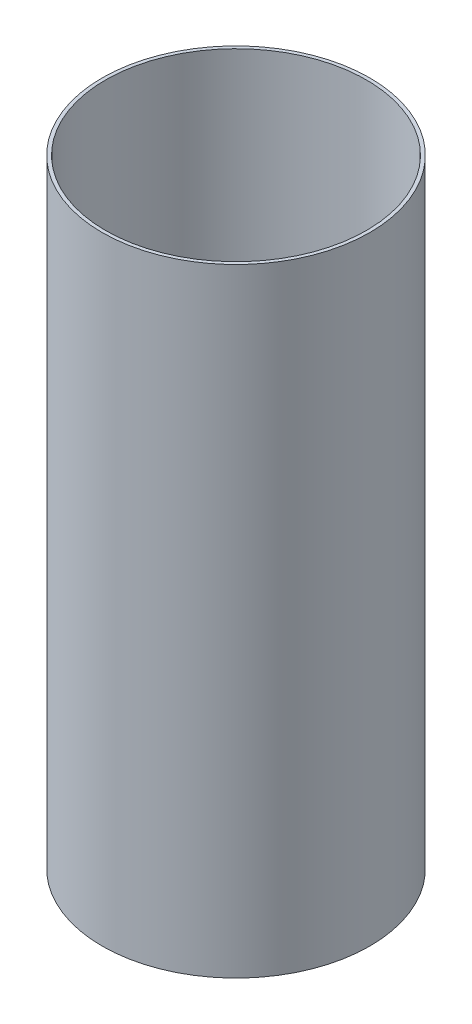
ISO-10303-21;
HEADER;
FILE_DESCRIPTION(('STEP AP214'),'2;1');
FILE_NAME('part.step','',(''),(''),'','','');
FILE_SCHEMA(('AUTOMOTIVE_DESIGN { 1 0 10303 214 1 1 1 1 }'));
ENDSEC;
DATA;
#1=APPLICATION_CONTEXT('core data for automotive mechanical design processes');
#2=APPLICATION_PROTOCOL_DEFINITION('international standard','automotive_design',2000,#1);
#3=PRODUCT_CONTEXT('',#1,'mechanical');
#4=PRODUCT('Part','Part','',(#3));
#5=PRODUCT_RELATED_PRODUCT_CATEGORY('part','',(#4));
#6=PRODUCT_DEFINITION_FORMATION('','',#4);
#7=PRODUCT_DEFINITION_CONTEXT('part definition',#1,'design');
#8=PRODUCT_DEFINITION('design','',#6,#7);
#9=PRODUCT_DEFINITION_SHAPE('','',#8);
#10=(LENGTH_UNIT() NAMED_UNIT(*) SI_UNIT(.MILLI.,.METRE.));
#11=(NAMED_UNIT(*) PLANE_ANGLE_UNIT() SI_UNIT($,.RADIAN.));
#12=(NAMED_UNIT(*) SI_UNIT($,.STERADIAN.) SOLID_ANGLE_UNIT());
#13=UNCERTAINTY_MEASURE_WITH_UNIT(LENGTH_MEASURE(1.E-05),#10,'distance_accuracy_value','');
#14=(GEOMETRIC_REPRESENTATION_CONTEXT(3) GLOBAL_UNCERTAINTY_ASSIGNED_CONTEXT((#13)) GLOBAL_UNIT_ASSIGNED_CONTEXT((#10,
#11,#12)) REPRESENTATION_CONTEXT('',''));
#15=CARTESIAN_POINT('',(0.,0.,0.));
#16=DIRECTION('',(0.,0.,1.));
#17=DIRECTION('',(1.,0.,0.));
#18=AXIS2_PLACEMENT_3D('',#15,#16,#17);
#19=CARTESIAN_POINT('',(0.,228.6,0.));
#20=DIRECTION('',(0.,1.,0.));
#21=DIRECTION('',(0.,0.,1.));
#22=AXIS2_PLACEMENT_3D('',#19,#20,#21);
#23=PLANE('',#22);
#24=CARTESIAN_POINT('',(0.,228.6,0.));
#25=DIRECTION('',(0.,1.,0.));
#26=DIRECTION('',(0.,0.,1.));
#27=AXIS2_PLACEMENT_3D('',#24,#25,#26);
#28=CIRCLE('',#27,49.53);
#29=CARTESIAN_POINT('',(0.,228.6,49.53));
#30=VERTEX_POINT('',#29);
#31=EDGE_CURVE('E10',#30,#30,#28,.T.);
#32=ORIENTED_EDGE('',*,*,#31,.T.);
#33=EDGE_LOOP('',(#32));
#34=FACE_BOUND('',#33,.T.);
#35=CARTESIAN_POINT('',(0.,228.6,0.));
#36=DIRECTION('',(0.,1.,0.));
#37=DIRECTION('',(0.,0.,1.));
#38=AXIS2_PLACEMENT_3D('',#35,#36,#37);
#39=CIRCLE('',#38,48.26);
#40=CARTESIAN_POINT('',(0.,228.6,48.26));
#41=VERTEX_POINT('',#40);
#42=EDGE_CURVE('E42',#41,#41,#39,.T.);
#43=ORIENTED_EDGE('',*,*,#42,.F.);
#44=EDGE_LOOP('',(#43));
#45=FACE_BOUND('',#44,.T.);
#46=ADVANCED_FACE('F31',(#34,#45),#23,.T.);
#47=CARTESIAN_POINT('',(0.,0.,0.));
#48=DIRECTION('',(0.,1.,0.));
#49=DIRECTION('',(0.,0.,1.));
#50=AXIS2_PLACEMENT_3D('',#47,#48,#49);
#51=PLANE('',#50);
#52=CARTESIAN_POINT('',(0.,0.,0.));
#53=DIRECTION('',(0.,1.,0.));
#54=DIRECTION('',(0.,0.,1.));
#55=AXIS2_PLACEMENT_3D('',#52,#53,#54);
#56=CIRCLE('',#55,49.53);
#57=CARTESIAN_POINT('',(0.,0.,49.53));
#58=VERTEX_POINT('',#57);
#59=EDGE_CURVE('E35',#58,#58,#56,.T.);
#60=ORIENTED_EDGE('',*,*,#59,.F.);
#61=EDGE_LOOP('',(#60));
#62=FACE_BOUND('',#61,.T.);
#63=CARTESIAN_POINT('',(0.,0.,0.));
#64=DIRECTION('',(0.,1.,0.));
#65=DIRECTION('',(0.,0.,1.));
#66=AXIS2_PLACEMENT_3D('',#63,#64,#65);
#67=CIRCLE('',#66,48.26);
#68=CARTESIAN_POINT('',(0.,0.,48.26));
#69=VERTEX_POINT('',#68);
#70=EDGE_CURVE('E44',#69,#69,#67,.T.);
#71=ORIENTED_EDGE('',*,*,#70,.T.);
#72=EDGE_LOOP('',(#71));
#73=FACE_BOUND('',#72,.T.);
#74=ADVANCED_FACE('F54',(#62,#73),#51,.F.);
#75=CARTESIAN_POINT('',(0.,228.6,0.));
#76=DIRECTION('',(0.,-1.,0.));
#77=DIRECTION('',(0.,0.,-1.));
#78=AXIS2_PLACEMENT_3D('',#75,#76,#77);
#79=CYLINDRICAL_SURFACE('',#78,49.53);
#80=ORIENTED_EDGE('',*,*,#31,.F.);
#81=EDGE_LOOP('',(#80));
#82=FACE_BOUND('',#81,.T.);
#83=ORIENTED_EDGE('',*,*,#59,.T.);
#84=EDGE_LOOP('',(#83));
#85=FACE_BOUND('',#84,.T.);
#86=ADVANCED_FACE('F33',(#82,#85),#79,.T.);
#87=CARTESIAN_POINT('',(0.,228.6,0.));
#88=DIRECTION('',(0.,-1.,0.));
#89=DIRECTION('',(0.,0.,-1.));
#90=AXIS2_PLACEMENT_3D('',#87,#88,#89);
#91=CYLINDRICAL_SURFACE('',#90,48.26);
#92=ORIENTED_EDGE('',*,*,#42,.T.);
#93=EDGE_LOOP('',(#92));
#94=FACE_BOUND('',#93,.T.);
#95=ORIENTED_EDGE('',*,*,#70,.F.);
#96=EDGE_LOOP('',(#95));
#97=FACE_BOUND('',#96,.T.);
#98=ADVANCED_FACE('F50',(#94,#97),#91,.F.);
#99=CLOSED_SHELL('',(#46,#74,#86,#98));
#100=MANIFOLD_SOLID_BREP('B2',#99);
#101=ADVANCED_BREP_SHAPE_REPRESENTATION('',(#18,#100),#14);
#102=SHAPE_DEFINITION_REPRESENTATION(#9,#101);
ENDSEC;
END-ISO-10303-21;
